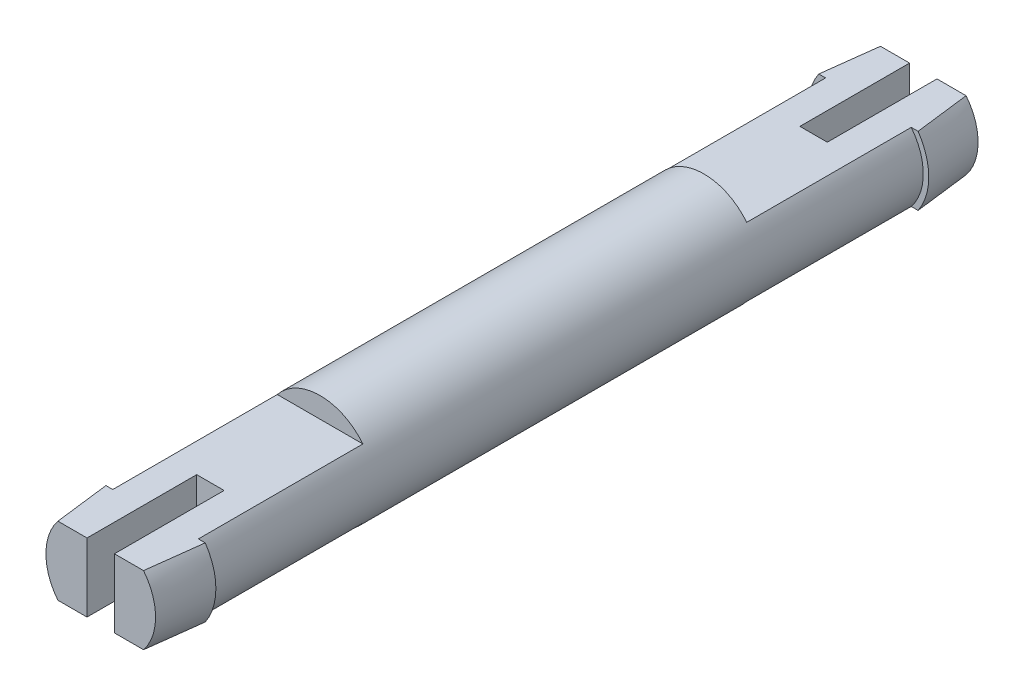
ISO-10303-21;
HEADER;
FILE_DESCRIPTION(('STEP AP214'),'2;1');
FILE_NAME('part.step','',(''),(''),'','','');
FILE_SCHEMA(('AUTOMOTIVE_DESIGN { 1 0 10303 214 1 1 1 1 }'));
ENDSEC;
DATA;
#1=APPLICATION_CONTEXT('core data for automotive mechanical design processes');
#2=APPLICATION_PROTOCOL_DEFINITION('international standard','automotive_design',2000,#1);
#3=PRODUCT_CONTEXT('',#1,'mechanical');
#4=PRODUCT('Part','Part','',(#3));
#5=PRODUCT_RELATED_PRODUCT_CATEGORY('part','',(#4));
#6=PRODUCT_DEFINITION_FORMATION('','',#4);
#7=PRODUCT_DEFINITION_CONTEXT('part definition',#1,'design');
#8=PRODUCT_DEFINITION('design','',#6,#7);
#9=PRODUCT_DEFINITION_SHAPE('','',#8);
#10=(LENGTH_UNIT() NAMED_UNIT(*) SI_UNIT(.MILLI.,.METRE.));
#11=(NAMED_UNIT(*) PLANE_ANGLE_UNIT() SI_UNIT($,.RADIAN.));
#12=(NAMED_UNIT(*) SI_UNIT($,.STERADIAN.) SOLID_ANGLE_UNIT());
#13=UNCERTAINTY_MEASURE_WITH_UNIT(LENGTH_MEASURE(1.E-05),#10,'distance_accuracy_value','');
#14=(GEOMETRIC_REPRESENTATION_CONTEXT(3) GLOBAL_UNCERTAINTY_ASSIGNED_CONTEXT((#13)) GLOBAL_UNIT_ASSIGNED_CONTEXT((#10,
#11,#12)) REPRESENTATION_CONTEXT('',''));
#15=CARTESIAN_POINT('',(0.,0.,0.));
#16=DIRECTION('',(0.,0.,1.));
#17=DIRECTION('',(1.,0.,0.));
#18=AXIS2_PLACEMENT_3D('',#15,#16,#17);
#19=CARTESIAN_POINT('',(0.,0.,-30.));
#20=DIRECTION('',(0.,0.,1.));
#21=DIRECTION('',(1.,0.,0.));
#22=AXIS2_PLACEMENT_3D('',#19,#20,#21);
#23=PLANE('',#22);
#24=DIRECTION('',(-1.,0.,0.));
#25=VECTOR('',#24,1.);
#26=CARTESIAN_POINT('',(0.,-1.25,-30.));
#27=LINE('',#26,#25);
#28=CARTESIAN_POINT('',(1.5612494995996,-1.25,-30.));
#29=VERTEX_POINT('',#28);
#30=CARTESIAN_POINT('',(0.500000000000001,-1.25,-30.));
#31=VERTEX_POINT('',#30);
#32=EDGE_CURVE('E218',#29,#31,#27,.T.);
#33=ORIENTED_EDGE('',*,*,#32,.T.);
#34=DIRECTION('',(0.,1.,0.));
#35=VECTOR('',#34,1.);
#36=CARTESIAN_POINT('',(0.500000000000001,-2.,-30.));
#37=LINE('',#36,#35);
#38=CARTESIAN_POINT('',(0.500000000000001,1.25,-30.));
#39=VERTEX_POINT('',#38);
#40=EDGE_CURVE('E204',#31,#39,#37,.T.);
#41=ORIENTED_EDGE('',*,*,#40,.T.);
#42=DIRECTION('',(1.,0.,0.));
#43=VECTOR('',#42,1.);
#44=CARTESIAN_POINT('',(0.,1.25,-30.));
#45=LINE('',#44,#43);
#46=CARTESIAN_POINT('',(1.5612494995996,1.25,-30.));
#47=VERTEX_POINT('',#46);
#48=EDGE_CURVE('E216',#39,#47,#45,.T.);
#49=ORIENTED_EDGE('',*,*,#48,.T.);
#50=CARTESIAN_POINT('',(0.,0.,-30.));
#51=DIRECTION('',(0.,0.,1.));
#52=DIRECTION('',(1.,0.,0.));
#53=AXIS2_PLACEMENT_3D('',#50,#51,#52);
#54=CIRCLE('',#53,2.);
#55=EDGE_CURVE('E421',#29,#47,#54,.T.);
#56=ORIENTED_EDGE('',*,*,#55,.F.);
#57=EDGE_LOOP('',(#33,#41,#49,#56));
#58=FACE_BOUND('',#57,.T.);
#59=ADVANCED_FACE('F39',(#58),#23,.F.);
#60=CARTESIAN_POINT('',(0.,0.,-28.));
#61=DIRECTION('',(0.,0.,1.));
#62=DIRECTION('',(1.,0.,0.));
#63=AXIS2_PLACEMENT_3D('',#60,#61,#62);
#64=PLANE('',#63);
#65=DIRECTION('',(-1.,0.,0.));
#66=VECTOR('',#65,1.);
#67=CARTESIAN_POINT('',(0.,-1.25,-28.));
#68=LINE('',#67,#66);
#69=CARTESIAN_POINT('',(1.81038669902327,-1.25,-28.0000000000001));
#70=VERTEX_POINT('',#69);
#71=CARTESIAN_POINT('',(1.5612494995996,-1.25,-28.));
#72=VERTEX_POINT('',#71);
#73=EDGE_CURVE('E266',#70,#72,#68,.T.);
#74=ORIENTED_EDGE('',*,*,#73,.F.);
#75=CARTESIAN_POINT('',(0.,0.,-28.));
#76=DIRECTION('',(0.,0.,1.));
#77=DIRECTION('',(1.,0.,0.));
#78=AXIS2_PLACEMENT_3D('',#75,#76,#77);
#79=CIRCLE('',#78,2.2);
#80=CARTESIAN_POINT('',(1.81038669902327,1.25,-28.0000000000001));
#81=VERTEX_POINT('',#80);
#82=EDGE_CURVE('E316',#70,#81,#79,.T.);
#83=ORIENTED_EDGE('',*,*,#82,.T.);
#84=DIRECTION('',(1.,0.,0.));
#85=VECTOR('',#84,1.);
#86=CARTESIAN_POINT('',(0.,1.25,-28.));
#87=LINE('',#86,#85);
#88=CARTESIAN_POINT('',(1.5612494995996,1.25,-28.));
#89=VERTEX_POINT('',#88);
#90=EDGE_CURVE('E299',#89,#81,#87,.T.);
#91=ORIENTED_EDGE('',*,*,#90,.F.);
#92=CARTESIAN_POINT('',(0.,0.,-28.));
#93=DIRECTION('',(0.,0.,1.));
#94=DIRECTION('',(1.,0.,0.));
#95=AXIS2_PLACEMENT_3D('',#92,#93,#94);
#96=CIRCLE('',#95,2.);
#97=EDGE_CURVE('E228',#89,#72,#96,.F.);
#98=ORIENTED_EDGE('',*,*,#97,.T.);
#99=EDGE_LOOP('',(#74,#83,#91,#98));
#100=FACE_BOUND('',#99,.T.);
#101=ADVANCED_FACE('F462',(#100),#64,.T.);
#102=CARTESIAN_POINT('',(0.,0.,-28.));
#103=DIRECTION('',(0.,0.,1.));
#104=DIRECTION('',(1.,0.,0.));
#105=AXIS2_PLACEMENT_3D('',#102,#103,#104);
#106=CONICAL_SURFACE('',#105,2.2,0.0996686524911631);
#107=CARTESIAN_POINT('',(-2.07154781563106,-1.25,-25.8053511030935));
#108=CARTESIAN_POINT('',(-2.03550722726415,-1.25,-26.1139180179247));
#109=CARTESIAN_POINT('',(-1.99922295149764,-1.25,-26.4224563190549));
#110=CARTESIAN_POINT('',(-1.92607039278533,-1.25,-27.0394648246496));
#111=CARTESIAN_POINT('',(-1.88920210764817,-1.25,-27.3479350288541));
#112=CARTESIAN_POINT('',(-1.77758091435319,-1.25,-28.2731887554346));
#113=CARTESIAN_POINT('',(-1.70180760472733,-1.25,-28.889850372761));
#114=CARTESIAN_POINT('',(-1.58512147260778,-1.25,-29.8144760218349));
#115=CARTESIAN_POINT('',(-1.54572075887383,-1.25,-30.122630781761));
#116=CARTESIAN_POINT('',(-1.46564062998623,-1.25,-30.73877265943));
#117=CARTESIAN_POINT('',(-1.42496122188891,-1.25,-31.0467597780885));
#118=CARTESIAN_POINT('',(-1.34198072748191,-1.25,-31.6625339402322));
#119=CARTESIAN_POINT('',(-1.29967955336674,-1.25,-31.9703209719642));
#120=CARTESIAN_POINT('',(-1.21285635248195,-1.25,-32.5855868834585));
#121=CARTESIAN_POINT('',(-1.16833428338408,-1.25,-32.8930657572336));
#122=CARTESIAN_POINT('',(-1.12240193199713,-1.25,-33.2003390005902));
#123=B_SPLINE_CURVE_WITH_KNOTS('',3,(#107,#108,#109,#110,#111,#112,#113,#114,#115,#116,#117,
#118,#119,#120,#121,#122),.UNSPECIFIED.,.F.,.F.,(4,2,2,2,2,2,2,4),(0.,0.931993165762317,
1.86398982945296,3.7278775087708,4.65986577266912,5.59184889439994,6.52388254692386,
7.45593396996271),.UNSPECIFIED.);
#124=CARTESIAN_POINT('',(-1.81038669902327,-1.25,-28.0000000000001));
#125=VERTEX_POINT('',#124);
#126=CARTESIAN_POINT('',(-1.5612494995996,-1.25,-30.));
#127=VERTEX_POINT('',#126);
#128=EDGE_CURVE('E281',#125,#127,#123,.T.);
#129=ORIENTED_EDGE('',*,*,#128,.F.);
#130=CARTESIAN_POINT('',(-1.81038669902327,1.25,-28.0000000000001));
#131=VERTEX_POINT('',#130);
#132=EDGE_CURVE('E317',#131,#125,#79,.T.);
#133=ORIENTED_EDGE('',*,*,#132,.F.);
#134=CARTESIAN_POINT('',(-1.12240193199713,1.25,-33.2003390005902));
#135=CARTESIAN_POINT('',(-1.16007318188191,1.25,-32.9484550212629));
#136=CARTESIAN_POINT('',(-1.19677568222067,1.25,-32.6964288561933));
#137=CARTESIAN_POINT('',(-1.26860770564257,1.25,-32.1921552657798));
#138=CARTESIAN_POINT('',(-1.30373724824443,1.25,-31.9399078432212));
#139=CARTESIAN_POINT('',(-1.37278762127904,1.25,-31.4352571718187));
#140=CARTESIAN_POINT('',(-1.40670849276504,1.25,-31.1828539285641));
#141=CARTESIAN_POINT('',(-1.47357063225506,1.25,-30.6779171395039));
#142=CARTESIAN_POINT('',(-1.50651189747342,1.25,-30.4253835933298));
#143=CARTESIAN_POINT('',(-1.56766910496901,1.25,-29.9506559350624));
#144=CARTESIAN_POINT('',(-1.59597605442951,1.25,-29.7284735200067));
#145=CARTESIAN_POINT('',(-1.66291250795864,1.25,-29.198043320873));
#146=CARTESIAN_POINT('',(-1.70129728585269,1.25,-28.8897646573885));
#147=CARTESIAN_POINT('',(-1.77723656698478,1.25,-28.2731045277542));
#148=CARTESIAN_POINT('',(-1.81479106820384,1.25,-27.9647230613564));
#149=CARTESIAN_POINT('',(-1.88921121609686,1.25,-27.3478817112025));
#150=CARTESIAN_POINT('',(-1.92607687286844,1.25,-27.0394218286632));
#151=CARTESIAN_POINT('',(-1.99922418459549,1.25,-26.4224342581659));
#152=CARTESIAN_POINT('',(-2.0355058422845,1.25,-26.1139065705321));
#153=CARTESIAN_POINT('',(-2.07154781563106,1.25,-25.8053511030935));
#154=B_SPLINE_CURVE_WITH_KNOTS('',3,(#134,#135,#136,#137,#138,#139,#140,#141,#142,#143,#144,
#145,#146,#147,#148,#149,#150,#151,#152,#153),.UNSPECIFIED.,.F.,.F.,(4,2,2,2,2,2,2,2,2,4),(0.,
0.764050536151589,1.52809158862138,2.29210666519175,3.05612391415667,3.72805834866275,
4.66003438385202,5.59201268506308,6.52397731386889,7.45593757911201),.UNSPECIFIED.);
#155=CARTESIAN_POINT('',(-1.5612494995996,1.25,-30.));
#156=VERTEX_POINT('',#155);
#157=EDGE_CURVE('E306',#156,#131,#154,.T.);
#158=ORIENTED_EDGE('',*,*,#157,.F.);
#159=EDGE_CURVE('E422',#156,#127,#54,.T.);
#160=ORIENTED_EDGE('',*,*,#159,.T.);
#161=EDGE_LOOP('',(#129,#133,#158,#160));
#162=FACE_BOUND('',#161,.T.);
#163=ADVANCED_FACE('F468',(#162),#106,.T.);
#164=CARTESIAN_POINT('',(0.,0.,0.));
#165=DIRECTION('',(0.,0.,1.));
#166=DIRECTION('',(1.,0.,0.));
#167=AXIS2_PLACEMENT_3D('',#164,#165,#166);
#168=PLANE('',#167);
#169=DIRECTION('',(0.,-1.,0.));
#170=VECTOR('',#169,1.);
#171=CARTESIAN_POINT('',(-0.5,2.001,0.));
#172=LINE('',#171,#170);
#173=CARTESIAN_POINT('',(-0.5,1.25,0.));
#174=VERTEX_POINT('',#173);
#175=CARTESIAN_POINT('',(-0.5,-1.25,0.));
#176=VERTEX_POINT('',#175);
#177=EDGE_CURVE('E333',#174,#176,#172,.T.);
#178=ORIENTED_EDGE('',*,*,#177,.F.);
#179=DIRECTION('',(1.,0.,0.));
#180=VECTOR('',#179,1.);
#181=CARTESIAN_POINT('',(0.,1.25,0.));
#182=LINE('',#181,#180);
#183=CARTESIAN_POINT('',(-1.5612494995996,1.25,0.));
#184=VERTEX_POINT('',#183);
#185=EDGE_CURVE('E436',#184,#174,#182,.T.);
#186=ORIENTED_EDGE('',*,*,#185,.F.);
#187=CARTESIAN_POINT('',(0.,0.,0.));
#188=DIRECTION('',(0.,0.,1.));
#189=DIRECTION('',(1.,0.,0.));
#190=AXIS2_PLACEMENT_3D('',#187,#188,#189);
#191=CIRCLE('',#190,2.);
#192=CARTESIAN_POINT('',(-1.5612494995996,-1.25,0.));
#193=VERTEX_POINT('',#192);
#194=EDGE_CURVE('E417',#184,#193,#191,.T.);
#195=ORIENTED_EDGE('',*,*,#194,.T.);
#196=DIRECTION('',(-1.,0.,0.));
#197=VECTOR('',#196,1.);
#198=CARTESIAN_POINT('',(0.,-1.25,0.));
#199=LINE('',#198,#197);
#200=EDGE_CURVE('E429',#176,#193,#199,.T.);
#201=ORIENTED_EDGE('',*,*,#200,.F.);
#202=EDGE_LOOP('',(#178,#186,#195,#201));
#203=FACE_BOUND('',#202,.T.);
#204=ADVANCED_FACE('F492',(#203),#168,.T.);
#205=CARTESIAN_POINT('',(0.,0.,0.));
#206=DIRECTION('',(0.,0.,-1.));
#207=DIRECTION('',(-1.,0.,0.));
#208=AXIS2_PLACEMENT_3D('',#205,#206,#207);
#209=CONICAL_SURFACE('',#208,2.,0.0996686524911612);
#210=CARTESIAN_POINT('',(-2.20629085167544,1.25,-5.35787712366069));
#211=CARTESIAN_POINT('',(-2.16911364127435,1.25,-5.03442418142203));
#212=CARTESIAN_POINT('',(-2.13171451989948,1.25,-4.71099685663596));
#213=CARTESIAN_POINT('',(-2.05638780976397,1.25,-4.06420290953939));
#214=CARTESIAN_POINT('',(-2.01846021960565,1.25,-3.74083628739171));
#215=CARTESIAN_POINT('',(-1.90376109024389,1.25,-2.77086975377676));
#216=CARTESIAN_POINT('',(-1.82607027221003,1.25,-2.12437765306016));
#217=CARTESIAN_POINT('',(-1.70685435031514,1.25,-1.15495865945316));
#218=CARTESIAN_POINT('',(-1.6666684414073,1.25,-0.831867113806437));
#219=CARTESIAN_POINT('',(-1.58517894557185,1.25,-0.185825927060357));
#220=CARTESIAN_POINT('',(-1.54387536251856,1.25,0.137123714526958));
#221=CARTESIAN_POINT('',(-1.45986916908057,1.25,0.782854266012029));
#222=CARTESIAN_POINT('',(-1.41716650618307,1.25,1.10563516911336));
#223=CARTESIAN_POINT('',(-1.32989270639121,1.25,1.75094775860943));
#224=CARTESIAN_POINT('',(-1.28532154707356,1.25,2.07347944196603));
#225=CARTESIAN_POINT('',(-1.23958118370651,1.25,2.39584846975234));
#226=B_SPLINE_CURVE_WITH_KNOTS('',3,(#210,#211,#212,#213,#214,#215,#216,#217,#218,#219,#220,
#221,#222,#223,#224,#225),.UNSPECIFIED.,.F.,.F.,(4,2,2,2,2,2,2,4),(0.,0.976747065340103,
1.95349671443936,3.90691894725974,4.88366075798535,5.86039918335277,6.83717431153944,
7.81396116508773),.UNSPECIFIED.);
#227=CARTESIAN_POINT('',(-1.81038669902317,1.25,-2.));
#228=VERTEX_POINT('',#227);
#229=EDGE_CURVE('E349',#228,#184,#226,.T.);
#230=ORIENTED_EDGE('',*,*,#229,.F.);
#231=CARTESIAN_POINT('',(0.,0.,-2.));
#232=DIRECTION('',(0.,0.,1.));
#233=DIRECTION('',(1.,0.,0.));
#234=AXIS2_PLACEMENT_3D('',#231,#232,#233);
#235=CIRCLE('',#234,2.2);
#236=CARTESIAN_POINT('',(-1.81038669902317,-1.25,-2.));
#237=VERTEX_POINT('',#236);
#238=EDGE_CURVE('E413',#228,#237,#235,.T.);
#239=ORIENTED_EDGE('',*,*,#238,.T.);
#240=CARTESIAN_POINT('',(-1.23958118370651,-1.25,2.39584846975234));
#241=CARTESIAN_POINT('',(-1.27708445163936,-1.25,2.1316265009786));
#242=CARTESIAN_POINT('',(-1.31378723609279,-1.25,1.86729257599781));
#243=CARTESIAN_POINT('',(-1.38587498011765,-1.25,1.33844690886303));
#244=CARTESIAN_POINT('',(-1.42125994975576,-1.25,1.07393516808307));
#245=CARTESIAN_POINT('',(-1.49099498681418,-1.25,0.544781873474838));
#246=CARTESIAN_POINT('',(-1.5253450774814,-1.25,0.280140322698454));
#247=CARTESIAN_POINT('',(-1.59319606726225,-1.25,-0.249251984131472));
#248=CARTESIAN_POINT('',(-1.62669696491898,-1.25,-0.514002740371576));
#249=CARTESIAN_POINT('',(-1.68902097967955,-1.25,-1.01186777884924));
#250=CARTESIAN_POINT('',(-1.71792365975446,-1.25,-1.24497212268678));
#251=CARTESIAN_POINT('',(-1.8260728146173,-1.25,-2.12439276505839));
#252=CARTESIAN_POINT('',(-1.90376491575885,-1.25,-2.77090043818358));
#253=CARTESIAN_POINT('',(-2.01846468029956,-1.25,-3.74087483946421));
#254=CARTESIAN_POINT('',(-2.056391393145,-1.25,-4.06423386196728));
#255=CARTESIAN_POINT('',(-2.13171635303436,-1.25,-4.71101241305846));
#256=CARTESIAN_POINT('',(-2.16911460179215,-1.25,-5.03443194144689));
#257=CARTESIAN_POINT('',(-2.20629085167544,-1.25,-5.35787712366069));
#258=B_SPLINE_CURVE_WITH_KNOTS('',3,(#240,#241,#242,#243,#244,#245,#246,#247,#248,#249,#250,
#251,#252,#253,#254,#255,#256,#257),.UNSPECIFIED.,.F.,.F.,(4,2,2,2,2,2,2,2,4),(0.,
0.800607232202053,1.60120834737589,2.40179146488677,3.2023759557953,3.90704351295182,
5.86051217913123,6.83723890380335,7.81396246011894),.UNSPECIFIED.);
#259=EDGE_CURVE('E404',#193,#237,#258,.T.);
#260=ORIENTED_EDGE('',*,*,#259,.F.);
#261=ORIENTED_EDGE('',*,*,#194,.F.);
#262=EDGE_LOOP('',(#230,#239,#260,#261));
#263=FACE_BOUND('',#262,.T.);
#264=ADVANCED_FACE('F496',(#263),#209,.T.);
#265=CARTESIAN_POINT('',(0.,0.,-2.));
#266=DIRECTION('',(0.,0.,-1.));
#267=DIRECTION('',(-1.,0.,0.));
#268=AXIS2_PLACEMENT_3D('',#265,#266,#267);
#269=PLANE('',#268);
#270=DIRECTION('',(-1.,0.,0.));
#271=VECTOR('',#270,1.);
#272=CARTESIAN_POINT('',(0.,1.25,-2.));
#273=LINE('',#272,#271);
#274=CARTESIAN_POINT('',(1.81038669902317,1.25,-2.));
#275=VERTEX_POINT('',#274);
#276=CARTESIAN_POINT('',(1.5612494995996,1.25,-2.));
#277=VERTEX_POINT('',#276);
#278=EDGE_CURVE('E350',#275,#277,#273,.T.);
#279=ORIENTED_EDGE('',*,*,#278,.F.);
#280=CARTESIAN_POINT('',(1.81038669902317,-1.25,-2.));
#281=VERTEX_POINT('',#280);
#282=EDGE_CURVE('E414',#281,#275,#235,.T.);
#283=ORIENTED_EDGE('',*,*,#282,.F.);
#284=DIRECTION('',(1.,0.,0.));
#285=VECTOR('',#284,1.);
#286=CARTESIAN_POINT('',(0.,-1.25,-2.));
#287=LINE('',#286,#285);
#288=CARTESIAN_POINT('',(1.5612494995996,-1.25,-2.));
#289=VERTEX_POINT('',#288);
#290=EDGE_CURVE('E386',#289,#281,#287,.T.);
#291=ORIENTED_EDGE('',*,*,#290,.F.);
#292=CARTESIAN_POINT('',(0.,0.,-2.));
#293=DIRECTION('',(0.,0.,-1.));
#294=DIRECTION('',(-1.,0.,0.));
#295=AXIS2_PLACEMENT_3D('',#292,#293,#294);
#296=CIRCLE('',#295,2.);
#297=EDGE_CURVE('E426',#289,#277,#296,.F.);
#298=ORIENTED_EDGE('',*,*,#297,.T.);
#299=EDGE_LOOP('',(#279,#283,#291,#298));
#300=FACE_BOUND('',#299,.T.);
#301=ADVANCED_FACE('F501',(#300),#269,.T.);
#302=CARTESIAN_POINT('',(0.,0.,-30.));
#303=DIRECTION('',(0.,0.,1.));
#304=DIRECTION('',(1.,0.,0.));
#305=AXIS2_PLACEMENT_3D('',#302,#303,#304);
#306=CYLINDRICAL_SURFACE('',#305,2.);
#307=DIRECTION('',(0.,0.,1.));
#308=VECTOR('',#307,1.);
#309=CARTESIAN_POINT('',(-1.5612494995996,-1.25,-30.));
#310=LINE('',#309,#308);
#311=CARTESIAN_POINT('',(-1.5612494995996,-1.25,-22.));
#312=VERTEX_POINT('',#311);
#313=CARTESIAN_POINT('',(-1.5612494995996,-1.25,-28.));
#314=VERTEX_POINT('',#313);
#315=EDGE_CURVE('E289',#312,#314,#310,.F.);
#316=ORIENTED_EDGE('',*,*,#315,.F.);
#317=CARTESIAN_POINT('',(0.,0.,-22.));
#318=DIRECTION('',(0.,0.,-1.));
#319=DIRECTION('',(-1.,0.,0.));
#320=AXIS2_PLACEMENT_3D('',#317,#318,#319);
#321=CIRCLE('',#320,2.);
#322=CARTESIAN_POINT('',(1.5612494995996,-1.25,-22.));
#323=VERTEX_POINT('',#322);
#324=EDGE_CURVE('E239',#312,#323,#321,.F.);
#325=ORIENTED_EDGE('',*,*,#324,.T.);
#326=DIRECTION('',(0.,0.,1.));
#327=VECTOR('',#326,1.);
#328=CARTESIAN_POINT('',(1.5612494995996,-1.25,-30.));
#329=LINE('',#328,#327);
#330=EDGE_CURVE('E288',#72,#323,#329,.T.);
#331=ORIENTED_EDGE('',*,*,#330,.F.);
#332=ORIENTED_EDGE('',*,*,#97,.F.);
#333=DIRECTION('',(0.,0.,1.));
#334=VECTOR('',#333,1.);
#335=CARTESIAN_POINT('',(1.5612494995996,1.25,-30.));
#336=LINE('',#335,#334);
#337=CARTESIAN_POINT('',(1.5612494995996,1.25,-22.));
#338=VERTEX_POINT('',#337);
#339=EDGE_CURVE('E313',#338,#89,#336,.F.);
#340=ORIENTED_EDGE('',*,*,#339,.F.);
#341=CARTESIAN_POINT('',(0.,0.,-22.));
#342=DIRECTION('',(0.,0.,1.));
#343=DIRECTION('',(1.,0.,0.));
#344=AXIS2_PLACEMENT_3D('',#341,#342,#343);
#345=CIRCLE('',#344,2.);
#346=CARTESIAN_POINT('',(-1.5612494995996,1.25,-22.));
#347=VERTEX_POINT('',#346);
#348=EDGE_CURVE('E231',#347,#338,#345,.F.);
#349=ORIENTED_EDGE('',*,*,#348,.F.);
#350=DIRECTION('',(0.,0.,1.));
#351=VECTOR('',#350,1.);
#352=CARTESIAN_POINT('',(-1.5612494995996,1.25,-30.));
#353=LINE('',#352,#351);
#354=CARTESIAN_POINT('',(-1.5612494995996,1.25,-28.));
#355=VERTEX_POINT('',#354);
#356=EDGE_CURVE('E314',#355,#347,#353,.T.);
#357=ORIENTED_EDGE('',*,*,#356,.F.);
#358=EDGE_CURVE('E233',#314,#355,#96,.F.);
#359=ORIENTED_EDGE('',*,*,#358,.F.);
#360=EDGE_LOOP('',(#316,#325,#331,#332,#340,#349,#357,#359));
#361=FACE_BOUND('',#360,.T.);
#362=DIRECTION('',(0.,0.,1.));
#363=VECTOR('',#362,1.);
#364=CARTESIAN_POINT('',(1.5612494995996,1.25,-30.));
#365=LINE('',#364,#363);
#366=CARTESIAN_POINT('',(1.5612494995996,1.25,-8.));
#367=VERTEX_POINT('',#366);
#368=EDGE_CURVE('E381',#277,#367,#365,.F.);
#369=ORIENTED_EDGE('',*,*,#368,.F.);
#370=ORIENTED_EDGE('',*,*,#297,.F.);
#371=DIRECTION('',(0.,0.,1.));
#372=VECTOR('',#371,1.);
#373=CARTESIAN_POINT('',(1.5612494995996,-1.25,-30.));
#374=LINE('',#373,#372);
#375=CARTESIAN_POINT('',(1.5612494995996,-1.25,-8.));
#376=VERTEX_POINT('',#375);
#377=EDGE_CURVE('E395',#376,#289,#374,.T.);
#378=ORIENTED_EDGE('',*,*,#377,.F.);
#379=CARTESIAN_POINT('',(0.,0.,-8.));
#380=DIRECTION('',(0.,0.,-1.));
#381=DIRECTION('',(-1.,0.,0.));
#382=AXIS2_PLACEMENT_3D('',#379,#380,#381);
#383=CIRCLE('',#382,2.);
#384=CARTESIAN_POINT('',(-1.5612494995996,-1.25,-8.));
#385=VERTEX_POINT('',#384);
#386=EDGE_CURVE('E433',#385,#376,#383,.F.);
#387=ORIENTED_EDGE('',*,*,#386,.F.);
#388=DIRECTION('',(0.,0.,1.));
#389=VECTOR('',#388,1.);
#390=CARTESIAN_POINT('',(-1.5612494995996,-1.25,-30.));
#391=LINE('',#390,#389);
#392=CARTESIAN_POINT('',(-1.5612494995996,-1.25,-2.));
#393=VERTEX_POINT('',#392);
#394=EDGE_CURVE('E411',#393,#385,#391,.F.);
#395=ORIENTED_EDGE('',*,*,#394,.F.);
#396=CARTESIAN_POINT('',(-1.5612494995996,1.25,-2.));
#397=VERTEX_POINT('',#396);
#398=EDGE_CURVE('E425',#397,#393,#296,.F.);
#399=ORIENTED_EDGE('',*,*,#398,.F.);
#400=DIRECTION('',(0.,0.,1.));
#401=VECTOR('',#400,1.);
#402=CARTESIAN_POINT('',(-1.5612494995996,1.25,-30.));
#403=LINE('',#402,#401);
#404=CARTESIAN_POINT('',(-1.5612494995996,1.25,-8.));
#405=VERTEX_POINT('',#404);
#406=EDGE_CURVE('E358',#405,#397,#403,.T.);
#407=ORIENTED_EDGE('',*,*,#406,.F.);
#408=CARTESIAN_POINT('',(0.,0.,-8.));
#409=DIRECTION('',(0.,0.,-1.));
#410=DIRECTION('',(-1.,0.,0.));
#411=AXIS2_PLACEMENT_3D('',#408,#409,#410);
#412=CIRCLE('',#411,2.);
#413=EDGE_CURVE('E438',#367,#405,#412,.F.);
#414=ORIENTED_EDGE('',*,*,#413,.F.);
#415=EDGE_LOOP('',(#369,#370,#378,#387,#395,#399,#407,#414));
#416=FACE_BOUND('',#415,.T.);
#417=ADVANCED_FACE('F41',(#361,#416),#306,.T.);
#418=CARTESIAN_POINT('',(1.23958118370651,1.25,2.39584846975234));
#419=CARTESIAN_POINT('',(1.27708445163936,1.25,2.1316265009786));
#420=CARTESIAN_POINT('',(1.31378723609279,1.25,1.86729257599781));
#421=CARTESIAN_POINT('',(1.38587498011765,1.25,1.33844690886303));
#422=CARTESIAN_POINT('',(1.42125994975576,1.25,1.07393516808307));
#423=CARTESIAN_POINT('',(1.49099498681418,1.25,0.544781873474838));
#424=CARTESIAN_POINT('',(1.5253450774814,1.25,0.280140322698454));
#425=CARTESIAN_POINT('',(1.59319606726225,1.25,-0.249251984131472));
#426=CARTESIAN_POINT('',(1.62669696491898,1.25,-0.514002740371576));
#427=CARTESIAN_POINT('',(1.68902097967955,1.25,-1.01186777884924));
#428=CARTESIAN_POINT('',(1.71792365975446,1.25,-1.24497212268678));
#429=CARTESIAN_POINT('',(1.8260728146173,1.25,-2.12439276505839));
#430=CARTESIAN_POINT('',(1.90376491575885,1.25,-2.77090043818358));
#431=CARTESIAN_POINT('',(2.01846468029956,1.25,-3.74087483946421));
#432=CARTESIAN_POINT('',(2.056391393145,1.25,-4.06423386196728));
#433=CARTESIAN_POINT('',(2.13171635303436,1.25,-4.71101241305846));
#434=CARTESIAN_POINT('',(2.16911460179215,1.25,-5.03443194144689));
#435=CARTESIAN_POINT('',(2.20629085167544,1.25,-5.35787712366069));
#436=B_SPLINE_CURVE_WITH_KNOTS('',3,(#418,#419,#420,#421,#422,#423,#424,#425,#426,#427,#428,
#429,#430,#431,#432,#433,#434,#435),.UNSPECIFIED.,.F.,.F.,(4,2,2,2,2,2,2,2,4),(0.,
0.800607232202053,1.60120834737589,2.40179146488677,3.2023759557953,3.90704351295182,
5.86051217913123,6.83723890380335,7.81396246011894),.UNSPECIFIED.);
#437=CARTESIAN_POINT('',(1.5612494995996,1.25,0.));
#438=VERTEX_POINT('',#437);
#439=EDGE_CURVE('E375',#438,#275,#436,.T.);
#440=ORIENTED_EDGE('',*,*,#439,.F.);
#441=CARTESIAN_POINT('',(1.5612494995996,-1.25,0.));
#442=VERTEX_POINT('',#441);
#443=EDGE_CURVE('E418',#442,#438,#191,.T.);
#444=ORIENTED_EDGE('',*,*,#443,.F.);
#445=CARTESIAN_POINT('',(2.20629085167544,-1.25,-5.35787712366069));
#446=CARTESIAN_POINT('',(2.16911364127435,-1.25,-5.03442418142203));
#447=CARTESIAN_POINT('',(2.13171451989948,-1.25,-4.71099685663596));
#448=CARTESIAN_POINT('',(2.05638780976397,-1.25,-4.06420290953939));
#449=CARTESIAN_POINT('',(2.01846021960565,-1.25,-3.74083628739171));
#450=CARTESIAN_POINT('',(1.90376109024389,-1.25,-2.77086975377676));
#451=CARTESIAN_POINT('',(1.82607027221003,-1.25,-2.12437765306016));
#452=CARTESIAN_POINT('',(1.70685435031514,-1.25,-1.15495865945316));
#453=CARTESIAN_POINT('',(1.6666684414073,-1.25,-0.831867113806437));
#454=CARTESIAN_POINT('',(1.58517894557185,-1.25,-0.185825927060357));
#455=CARTESIAN_POINT('',(1.54387536251856,-1.25,0.137123714526958));
#456=CARTESIAN_POINT('',(1.45986916908057,-1.25,0.782854266012029));
#457=CARTESIAN_POINT('',(1.41716650618307,-1.25,1.10563516911336));
#458=CARTESIAN_POINT('',(1.32989270639121,-1.25,1.75094775860943));
#459=CARTESIAN_POINT('',(1.28532154707356,-1.25,2.07347944196603));
#460=CARTESIAN_POINT('',(1.23958118370651,-1.25,2.39584846975234));
#461=B_SPLINE_CURVE_WITH_KNOTS('',3,(#445,#446,#447,#448,#449,#450,#451,#452,#453,#454,#455,
#456,#457,#458,#459,#460),.UNSPECIFIED.,.F.,.F.,(4,2,2,2,2,2,2,4),(0.,0.976747065340103,
1.95349671443936,3.90691894725974,4.88366075798535,5.86039918335277,6.83717431153944,
7.81396116508773),.UNSPECIFIED.);
#462=EDGE_CURVE('E388',#281,#442,#461,.T.);
#463=ORIENTED_EDGE('',*,*,#462,.F.);
#464=ORIENTED_EDGE('',*,*,#282,.T.);
#465=EDGE_LOOP('',(#440,#444,#463,#464));
#466=FACE_BOUND('',#465,.T.);
#467=ADVANCED_FACE('F360',(#466),#209,.T.);
#468=EDGE_CURVE('E347',#397,#228,#273,.T.);
#469=ORIENTED_EDGE('',*,*,#468,.F.);
#470=ORIENTED_EDGE('',*,*,#398,.T.);
#471=EDGE_CURVE('E389',#237,#393,#287,.T.);
#472=ORIENTED_EDGE('',*,*,#471,.F.);
#473=ORIENTED_EDGE('',*,*,#238,.F.);
#474=EDGE_LOOP('',(#469,#470,#472,#473));
#475=FACE_BOUND('',#474,.T.);
#476=ADVANCED_FACE('F402',(#475),#269,.T.);
#477=DIRECTION('',(0.,-1.,0.));
#478=VECTOR('',#477,1.);
#479=CARTESIAN_POINT('',(0.5,2.001,0.));
#480=LINE('',#479,#478);
#481=CARTESIAN_POINT('',(0.5,1.25,0.));
#482=VERTEX_POINT('',#481);
#483=CARTESIAN_POINT('',(0.5,-1.25,0.));
#484=VERTEX_POINT('',#483);
#485=EDGE_CURVE('E336',#482,#484,#480,.T.);
#486=ORIENTED_EDGE('',*,*,#485,.T.);
#487=EDGE_CURVE('E430',#442,#484,#199,.T.);
#488=ORIENTED_EDGE('',*,*,#487,.F.);
#489=ORIENTED_EDGE('',*,*,#443,.T.);
#490=EDGE_CURVE('E435',#482,#438,#182,.T.);
#491=ORIENTED_EDGE('',*,*,#490,.F.);
#492=EDGE_LOOP('',(#486,#488,#489,#491));
#493=FACE_BOUND('',#492,.T.);
#494=ADVANCED_FACE('F400',(#493),#168,.T.);
#495=CARTESIAN_POINT('',(-2.1,-1.25,-8.));
#496=DIRECTION('',(0.,1.,0.));
#497=DIRECTION('',(0.,0.,1.));
#498=AXIS2_PLACEMENT_3D('',#495,#496,#497);
#499=PLANE('',#498);
#500=DIRECTION('',(1.,0.,0.));
#501=VECTOR('',#500,1.);
#502=CARTESIAN_POINT('',(-0.5,-1.25,-4.));
#503=LINE('',#502,#501);
#504=CARTESIAN_POINT('',(-0.5,-1.25,-4.));
#505=VERTEX_POINT('',#504);
#506=CARTESIAN_POINT('',(0.5,-1.25,-4.));
#507=VERTEX_POINT('',#506);
#508=EDGE_CURVE('E327',#505,#507,#503,.T.);
#509=ORIENTED_EDGE('',*,*,#508,.F.);
#510=DIRECTION('',(0.,0.,-1.));
#511=VECTOR('',#510,1.);
#512=CARTESIAN_POINT('',(-0.5,-1.25,0.));
#513=LINE('',#512,#511);
#514=EDGE_CURVE('E324',#176,#505,#513,.T.);
#515=ORIENTED_EDGE('',*,*,#514,.F.);
#516=ORIENTED_EDGE('',*,*,#200,.T.);
#517=ORIENTED_EDGE('',*,*,#259,.T.);
#518=ORIENTED_EDGE('',*,*,#471,.T.);
#519=ORIENTED_EDGE('',*,*,#394,.T.);
#520=DIRECTION('',(-1.,0.,0.));
#521=VECTOR('',#520,1.);
#522=CARTESIAN_POINT('',(-2.1,-1.25,-8.));
#523=LINE('',#522,#521);
#524=EDGE_CURVE('E383',#376,#385,#523,.T.);
#525=ORIENTED_EDGE('',*,*,#524,.F.);
#526=ORIENTED_EDGE('',*,*,#377,.T.);
#527=ORIENTED_EDGE('',*,*,#290,.T.);
#528=ORIENTED_EDGE('',*,*,#462,.T.);
#529=ORIENTED_EDGE('',*,*,#487,.T.);
#530=DIRECTION('',(0.,0.,1.));
#531=VECTOR('',#530,1.);
#532=CARTESIAN_POINT('',(0.5,-1.25,0.));
#533=LINE('',#532,#531);
#534=EDGE_CURVE('E330',#507,#484,#533,.T.);
#535=ORIENTED_EDGE('',*,*,#534,.F.);
#536=EDGE_LOOP('',(#509,#515,#516,#517,#518,#519,#525,#526,#527,#528,#529,#535));
#537=FACE_BOUND('',#536,.T.);
#538=ADVANCED_FACE('F397',(#537),#499,.F.);
#539=CARTESIAN_POINT('',(-2.1,-1.25,-8.));
#540=DIRECTION('',(0.,0.,-1.));
#541=DIRECTION('',(-1.,0.,0.));
#542=AXIS2_PLACEMENT_3D('',#539,#540,#541);
#543=PLANE('',#542);
#544=ORIENTED_EDGE('',*,*,#386,.T.);
#545=ORIENTED_EDGE('',*,*,#524,.T.);
#546=EDGE_LOOP('',(#544,#545));
#547=FACE_BOUND('',#546,.T.);
#548=ADVANCED_FACE('F370',(#547),#543,.F.);
#549=CARTESIAN_POINT('',(-2.1,1.25,-8.));
#550=DIRECTION('',(0.,-1.,0.));
#551=DIRECTION('',(0.,0.,-1.));
#552=AXIS2_PLACEMENT_3D('',#549,#550,#551);
#553=PLANE('',#552);
#554=ORIENTED_EDGE('',*,*,#185,.T.);
#555=DIRECTION('',(0.,0.,1.));
#556=VECTOR('',#555,1.);
#557=CARTESIAN_POINT('',(-0.5,1.25,0.));
#558=LINE('',#557,#556);
#559=CARTESIAN_POINT('',(-0.5,1.25,-4.));
#560=VERTEX_POINT('',#559);
#561=EDGE_CURVE('E322',#560,#174,#558,.T.);
#562=ORIENTED_EDGE('',*,*,#561,.F.);
#563=DIRECTION('',(-1.,0.,0.));
#564=VECTOR('',#563,1.);
#565=CARTESIAN_POINT('',(-0.5,1.25,-4.));
#566=LINE('',#565,#564);
#567=CARTESIAN_POINT('',(0.5,1.25,-4.));
#568=VERTEX_POINT('',#567);
#569=EDGE_CURVE('E335',#568,#560,#566,.T.);
#570=ORIENTED_EDGE('',*,*,#569,.F.);
#571=DIRECTION('',(0.,0.,-1.));
#572=VECTOR('',#571,1.);
#573=CARTESIAN_POINT('',(0.5,1.25,0.));
#574=LINE('',#573,#572);
#575=EDGE_CURVE('E320',#482,#568,#574,.T.);
#576=ORIENTED_EDGE('',*,*,#575,.F.);
#577=ORIENTED_EDGE('',*,*,#490,.T.);
#578=ORIENTED_EDGE('',*,*,#439,.T.);
#579=ORIENTED_EDGE('',*,*,#278,.T.);
#580=ORIENTED_EDGE('',*,*,#368,.T.);
#581=DIRECTION('',(1.,0.,0.));
#582=VECTOR('',#581,1.);
#583=CARTESIAN_POINT('',(-2.1,1.25,-8.));
#584=LINE('',#583,#582);
#585=EDGE_CURVE('E344',#405,#367,#584,.T.);
#586=ORIENTED_EDGE('',*,*,#585,.F.);
#587=ORIENTED_EDGE('',*,*,#406,.T.);
#588=ORIENTED_EDGE('',*,*,#468,.T.);
#589=ORIENTED_EDGE('',*,*,#229,.T.);
#590=EDGE_LOOP('',(#554,#562,#570,#576,#577,#578,#579,#580,#586,#587,#588,#589));
#591=FACE_BOUND('',#590,.T.);
#592=ADVANCED_FACE('F364',(#591),#553,.F.);
#593=CARTESIAN_POINT('',(2.1,2.25,-8.));
#594=DIRECTION('',(0.,0.,-1.));
#595=DIRECTION('',(-1.,0.,0.));
#596=AXIS2_PLACEMENT_3D('',#593,#594,#595);
#597=PLANE('',#596);
#598=ORIENTED_EDGE('',*,*,#413,.T.);
#599=ORIENTED_EDGE('',*,*,#585,.T.);
#600=EDGE_LOOP('',(#598,#599));
#601=FACE_BOUND('',#600,.T.);
#602=ADVANCED_FACE('F369',(#601),#597,.F.);
#603=CARTESIAN_POINT('',(-0.5,2.001,0.));
#604=DIRECTION('',(-1.,0.,0.));
#605=DIRECTION('',(0.,0.,1.));
#606=AXIS2_PLACEMENT_3D('',#603,#604,#605);
#607=PLANE('',#606);
#608=ORIENTED_EDGE('',*,*,#561,.T.);
#609=ORIENTED_EDGE('',*,*,#177,.T.);
#610=ORIENTED_EDGE('',*,*,#514,.T.);
#611=DIRECTION('',(0.,-1.,0.));
#612=VECTOR('',#611,1.);
#613=CARTESIAN_POINT('',(-0.5,2.001,-4.));
#614=LINE('',#613,#612);
#615=EDGE_CURVE('E332',#560,#505,#614,.T.);
#616=ORIENTED_EDGE('',*,*,#615,.F.);
#617=EDGE_LOOP('',(#608,#609,#610,#616));
#618=FACE_BOUND('',#617,.T.);
#619=ADVANCED_FACE('F555',(#618),#607,.F.);
#620=CARTESIAN_POINT('',(0.5,2.001,0.));
#621=DIRECTION('',(1.,0.,0.));
#622=DIRECTION('',(0.,0.,-1.));
#623=AXIS2_PLACEMENT_3D('',#620,#621,#622);
#624=PLANE('',#623);
#625=ORIENTED_EDGE('',*,*,#575,.T.);
#626=DIRECTION('',(0.,-1.,0.));
#627=VECTOR('',#626,1.);
#628=CARTESIAN_POINT('',(0.5,2.001,-4.));
#629=LINE('',#628,#627);
#630=EDGE_CURVE('E339',#568,#507,#629,.T.);
#631=ORIENTED_EDGE('',*,*,#630,.T.);
#632=ORIENTED_EDGE('',*,*,#534,.T.);
#633=ORIENTED_EDGE('',*,*,#485,.F.);
#634=EDGE_LOOP('',(#625,#631,#632,#633));
#635=FACE_BOUND('',#634,.T.);
#636=ADVANCED_FACE('F560',(#635),#624,.F.);
#637=CARTESIAN_POINT('',(-0.5,2.001,-4.));
#638=DIRECTION('',(0.,0.,-1.));
#639=DIRECTION('',(-1.,0.,0.));
#640=AXIS2_PLACEMENT_3D('',#637,#638,#639);
#641=PLANE('',#640);
#642=ORIENTED_EDGE('',*,*,#569,.T.);
#643=ORIENTED_EDGE('',*,*,#615,.T.);
#644=ORIENTED_EDGE('',*,*,#508,.T.);
#645=ORIENTED_EDGE('',*,*,#630,.F.);
#646=EDGE_LOOP('',(#642,#643,#644,#645));
#647=FACE_BOUND('',#646,.T.);
#648=ADVANCED_FACE('F489',(#647),#641,.F.);
#649=EDGE_CURVE('E287',#314,#125,#68,.T.);
#650=ORIENTED_EDGE('',*,*,#649,.F.);
#651=ORIENTED_EDGE('',*,*,#358,.T.);
#652=EDGE_CURVE('E312',#131,#355,#87,.T.);
#653=ORIENTED_EDGE('',*,*,#652,.F.);
#654=ORIENTED_EDGE('',*,*,#132,.T.);
#655=EDGE_LOOP('',(#650,#651,#653,#654));
#656=FACE_BOUND('',#655,.T.);
#657=ADVANCED_FACE('F447',(#656),#64,.T.);
#658=CARTESIAN_POINT('',(1.12240193199713,-1.25,-33.2003390005902));
#659=CARTESIAN_POINT('',(1.16007318188191,-1.25,-32.9484550212629));
#660=CARTESIAN_POINT('',(1.19677568222068,-1.25,-32.6964288561933));
#661=CARTESIAN_POINT('',(1.26860770564257,-1.25,-32.1921552657798));
#662=CARTESIAN_POINT('',(1.30373724824443,-1.25,-31.9399078432212));
#663=CARTESIAN_POINT('',(1.37278762127905,-1.25,-31.4352571718187));
#664=CARTESIAN_POINT('',(1.40670849276504,-1.25,-31.1828539285641));
#665=CARTESIAN_POINT('',(1.47357063225507,-1.25,-30.6779171395039));
#666=CARTESIAN_POINT('',(1.50651189747342,-1.25,-30.4253835933298));
#667=CARTESIAN_POINT('',(1.56766910496902,-1.25,-29.9506559350624));
#668=CARTESIAN_POINT('',(1.59597605442952,-1.25,-29.7284735200067));
#669=CARTESIAN_POINT('',(1.66291250795864,-1.25,-29.198043320873));
#670=CARTESIAN_POINT('',(1.70129728585269,-1.25,-28.8897646573885));
#671=CARTESIAN_POINT('',(1.77723656698478,-1.25,-28.2731045277542));
#672=CARTESIAN_POINT('',(1.81479106820385,-1.25,-27.9647230613564));
#673=CARTESIAN_POINT('',(1.88921121609687,-1.25,-27.3478817112025));
#674=CARTESIAN_POINT('',(1.92607687286845,-1.25,-27.0394218286632));
#675=CARTESIAN_POINT('',(1.99922418459549,-1.25,-26.4224342581659));
#676=CARTESIAN_POINT('',(2.03550584228451,-1.25,-26.1139065705321));
#677=CARTESIAN_POINT('',(2.07154781563106,-1.25,-25.8053511030935));
#678=B_SPLINE_CURVE_WITH_KNOTS('',3,(#658,#659,#660,#661,#662,#663,#664,#665,#666,#667,#668,
#669,#670,#671,#672,#673,#674,#675,#676,#677),.UNSPECIFIED.,.F.,.F.,(4,2,2,2,2,2,2,2,2,4),(0.,
0.764050536151589,1.52809158862138,2.29210666519175,3.05612391415667,3.72805834866275,
4.66003438385202,5.59201268506308,6.52397731386889,7.45593757911201),.UNSPECIFIED.);
#679=EDGE_CURVE('E252',#29,#70,#678,.T.);
#680=ORIENTED_EDGE('',*,*,#679,.F.);
#681=ORIENTED_EDGE('',*,*,#55,.T.);
#682=CARTESIAN_POINT('',(2.07154781563106,1.25,-25.8053511030935));
#683=CARTESIAN_POINT('',(2.03550722726415,1.25,-26.1139180179247));
#684=CARTESIAN_POINT('',(1.99922295149765,1.25,-26.4224563190549));
#685=CARTESIAN_POINT('',(1.92607039278534,1.25,-27.0394648246496));
#686=CARTESIAN_POINT('',(1.88920210764817,1.25,-27.3479350288541));
#687=CARTESIAN_POINT('',(1.7775809143532,1.25,-28.2731887554346));
#688=CARTESIAN_POINT('',(1.70180760472734,1.25,-28.889850372761));
#689=CARTESIAN_POINT('',(1.58512147260778,1.25,-29.8144760218349));
#690=CARTESIAN_POINT('',(1.54572075887383,1.25,-30.122630781761));
#691=CARTESIAN_POINT('',(1.46564062998624,1.25,-30.73877265943));
#692=CARTESIAN_POINT('',(1.42496122188892,1.25,-31.0467597780885));
#693=CARTESIAN_POINT('',(1.34198072748192,1.25,-31.6625339402322));
#694=CARTESIAN_POINT('',(1.29967955336674,1.25,-31.9703209719642));
#695=CARTESIAN_POINT('',(1.21285635248195,1.25,-32.5855868834585));
#696=CARTESIAN_POINT('',(1.16833428338408,1.25,-32.8930657572336));
#697=CARTESIAN_POINT('',(1.12240193199713,1.25,-33.2003390005902));
#698=B_SPLINE_CURVE_WITH_KNOTS('',3,(#682,#683,#684,#685,#686,#687,#688,#689,#690,#691,#692,
#693,#694,#695,#696,#697),.UNSPECIFIED.,.F.,.F.,(4,2,2,2,2,2,2,4),(0.,0.931993165762317,
1.86398982945296,3.7278775087708,4.65986577266912,5.59184889439994,6.52388254692386,
7.45593396996271),.UNSPECIFIED.);
#699=EDGE_CURVE('E226',#81,#47,#698,.T.);
#700=ORIENTED_EDGE('',*,*,#699,.F.);
#701=ORIENTED_EDGE('',*,*,#82,.F.);
#702=EDGE_LOOP('',(#680,#681,#700,#701));
#703=FACE_BOUND('',#702,.T.);
#704=ADVANCED_FACE('F268',(#703),#106,.T.);
#705=CARTESIAN_POINT('',(-0.500000000000001,1.25,-30.));
#706=VERTEX_POINT('',#705);
#707=EDGE_CURVE('E227',#156,#706,#45,.T.);
#708=ORIENTED_EDGE('',*,*,#707,.T.);
#709=DIRECTION('',(0.,1.,0.));
#710=VECTOR('',#709,1.);
#711=CARTESIAN_POINT('',(-0.500000000000001,-2.,-30.));
#712=LINE('',#711,#710);
#713=CARTESIAN_POINT('',(-0.500000000000001,-1.25,-30.));
#714=VERTEX_POINT('',#713);
#715=EDGE_CURVE('E219',#714,#706,#712,.T.);
#716=ORIENTED_EDGE('',*,*,#715,.F.);
#717=EDGE_CURVE('E62',#714,#127,#27,.T.);
#718=ORIENTED_EDGE('',*,*,#717,.T.);
#719=ORIENTED_EDGE('',*,*,#159,.F.);
#720=EDGE_LOOP('',(#708,#716,#718,#719));
#721=FACE_BOUND('',#720,.T.);
#722=ADVANCED_FACE('F303',(#721),#23,.F.);
#723=CARTESIAN_POINT('',(2.1,1.25,-22.));
#724=DIRECTION('',(0.,-1.,0.));
#725=DIRECTION('',(0.,0.,-1.));
#726=AXIS2_PLACEMENT_3D('',#723,#724,#725);
#727=PLANE('',#726);
#728=ORIENTED_EDGE('',*,*,#48,.F.);
#729=DIRECTION('',(0.,0.,-1.));
#730=VECTOR('',#729,1.);
#731=CARTESIAN_POINT('',(0.500000000000001,1.25,-26.));
#732=LINE('',#731,#730);
#733=CARTESIAN_POINT('',(0.500000000000001,1.25,-26.));
#734=VERTEX_POINT('',#733);
#735=EDGE_CURVE('E201',#734,#39,#732,.T.);
#736=ORIENTED_EDGE('',*,*,#735,.F.);
#737=DIRECTION('',(1.,0.,0.));
#738=VECTOR('',#737,1.);
#739=CARTESIAN_POINT('',(-0.499999999999999,1.25,-26.));
#740=LINE('',#739,#738);
#741=CARTESIAN_POINT('',(-0.499999999999999,1.25,-26.));
#742=VERTEX_POINT('',#741);
#743=EDGE_CURVE('E220',#742,#734,#740,.T.);
#744=ORIENTED_EDGE('',*,*,#743,.F.);
#745=DIRECTION('',(0.,0.,1.));
#746=VECTOR('',#745,1.);
#747=CARTESIAN_POINT('',(-0.499999999999999,1.25,-26.));
#748=LINE('',#747,#746);
#749=EDGE_CURVE('E211',#706,#742,#748,.T.);
#750=ORIENTED_EDGE('',*,*,#749,.F.);
#751=ORIENTED_EDGE('',*,*,#707,.F.);
#752=ORIENTED_EDGE('',*,*,#157,.T.);
#753=ORIENTED_EDGE('',*,*,#652,.T.);
#754=ORIENTED_EDGE('',*,*,#356,.T.);
#755=DIRECTION('',(-1.,0.,0.));
#756=VECTOR('',#755,1.);
#757=CARTESIAN_POINT('',(2.1,1.25,-22.));
#758=LINE('',#757,#756);
#759=EDGE_CURVE('E291',#338,#347,#758,.T.);
#760=ORIENTED_EDGE('',*,*,#759,.F.);
#761=ORIENTED_EDGE('',*,*,#339,.T.);
#762=ORIENTED_EDGE('',*,*,#90,.T.);
#763=ORIENTED_EDGE('',*,*,#699,.T.);
#764=EDGE_LOOP('',(#728,#736,#744,#750,#751,#752,#753,#754,#760,#761,#762,#763));
#765=FACE_BOUND('',#764,.T.);
#766=ADVANCED_FACE('F223',(#765),#727,.F.);
#767=CARTESIAN_POINT('',(2.1,2.25,-22.));
#768=DIRECTION('',(0.,0.,1.));
#769=DIRECTION('',(1.,0.,0.));
#770=AXIS2_PLACEMENT_3D('',#767,#768,#769);
#771=PLANE('',#770);
#772=ORIENTED_EDGE('',*,*,#348,.T.);
#773=ORIENTED_EDGE('',*,*,#759,.T.);
#774=EDGE_LOOP('',(#772,#773));
#775=FACE_BOUND('',#774,.T.);
#776=ADVANCED_FACE('F277',(#775),#771,.F.);
#777=CARTESIAN_POINT('',(2.1,-1.25,-22.));
#778=DIRECTION('',(0.,1.,0.));
#779=DIRECTION('',(0.,0.,1.));
#780=AXIS2_PLACEMENT_3D('',#777,#778,#779);
#781=PLANE('',#780);
#782=DIRECTION('',(1.,0.,0.));
#783=VECTOR('',#782,1.);
#784=CARTESIAN_POINT('',(2.1,-1.25,-26.));
#785=LINE('',#784,#783);
#786=CARTESIAN_POINT('',(-0.5,-1.25,-26.));
#787=VERTEX_POINT('',#786);
#788=CARTESIAN_POINT('',(0.500000000000001,-1.25,-26.));
#789=VERTEX_POINT('',#788);
#790=EDGE_CURVE('E47',#787,#789,#785,.T.);
#791=ORIENTED_EDGE('',*,*,#790,.T.);
#792=DIRECTION('',(0.,0.,-1.));
#793=VECTOR('',#792,1.);
#794=CARTESIAN_POINT('',(0.5,-1.25,-22.));
#795=LINE('',#794,#793);
#796=EDGE_CURVE('E11',#789,#31,#795,.T.);
#797=ORIENTED_EDGE('',*,*,#796,.T.);
#798=ORIENTED_EDGE('',*,*,#32,.F.);
#799=ORIENTED_EDGE('',*,*,#679,.T.);
#800=ORIENTED_EDGE('',*,*,#73,.T.);
#801=ORIENTED_EDGE('',*,*,#330,.T.);
#802=DIRECTION('',(1.,0.,0.));
#803=VECTOR('',#802,1.);
#804=CARTESIAN_POINT('',(2.1,-1.25,-22.));
#805=LINE('',#804,#803);
#806=EDGE_CURVE('E249',#312,#323,#805,.T.);
#807=ORIENTED_EDGE('',*,*,#806,.F.);
#808=ORIENTED_EDGE('',*,*,#315,.T.);
#809=ORIENTED_EDGE('',*,*,#649,.T.);
#810=ORIENTED_EDGE('',*,*,#128,.T.);
#811=ORIENTED_EDGE('',*,*,#717,.F.);
#812=DIRECTION('',(0.,0.,1.));
#813=VECTOR('',#812,1.);
#814=CARTESIAN_POINT('',(-0.499999999999999,-1.25,-22.));
#815=LINE('',#814,#813);
#816=EDGE_CURVE('E242',#714,#787,#815,.T.);
#817=ORIENTED_EDGE('',*,*,#816,.T.);
#818=EDGE_LOOP('',(#791,#797,#798,#799,#800,#801,#807,#808,#809,#810,#811,#817));
#819=FACE_BOUND('',#818,.T.);
#820=ADVANCED_FACE('F246',(#819),#781,.F.);
#821=CARTESIAN_POINT('',(2.1,-2.25,-22.));
#822=DIRECTION('',(0.,0.,-1.));
#823=DIRECTION('',(-1.,0.,0.));
#824=AXIS2_PLACEMENT_3D('',#821,#822,#823);
#825=PLANE('',#824);
#826=ORIENTED_EDGE('',*,*,#806,.T.);
#827=ORIENTED_EDGE('',*,*,#324,.F.);
#828=EDGE_LOOP('',(#826,#827));
#829=FACE_BOUND('',#828,.T.);
#830=ADVANCED_FACE('F276',(#829),#825,.T.);
#831=CARTESIAN_POINT('',(0.500000000000001,-2.,-26.));
#832=DIRECTION('',(1.,0.,0.));
#833=DIRECTION('',(0.,0.,-1.));
#834=AXIS2_PLACEMENT_3D('',#831,#832,#833);
#835=PLANE('',#834);
#836=DIRECTION('',(0.,1.,0.));
#837=VECTOR('',#836,1.);
#838=CARTESIAN_POINT('',(0.500000000000001,-2.,-26.));
#839=LINE('',#838,#837);
#840=EDGE_CURVE('E206',#789,#734,#839,.T.);
#841=ORIENTED_EDGE('',*,*,#840,.T.);
#842=ORIENTED_EDGE('',*,*,#735,.T.);
#843=ORIENTED_EDGE('',*,*,#40,.F.);
#844=ORIENTED_EDGE('',*,*,#796,.F.);
#845=EDGE_LOOP('',(#841,#842,#843,#844));
#846=FACE_BOUND('',#845,.T.);
#847=ADVANCED_FACE('F203',(#846),#835,.F.);
#848=CARTESIAN_POINT('',(-0.499999999999999,-2.,-26.));
#849=DIRECTION('',(0.,0.,1.));
#850=DIRECTION('',(1.,0.,0.));
#851=AXIS2_PLACEMENT_3D('',#848,#849,#850);
#852=PLANE('',#851);
#853=DIRECTION('',(0.,1.,0.));
#854=VECTOR('',#853,1.);
#855=CARTESIAN_POINT('',(-0.499999999999999,-2.,-26.));
#856=LINE('',#855,#854);
#857=EDGE_CURVE('E54',#787,#742,#856,.T.);
#858=ORIENTED_EDGE('',*,*,#857,.T.);
#859=ORIENTED_EDGE('',*,*,#743,.T.);
#860=ORIENTED_EDGE('',*,*,#840,.F.);
#861=ORIENTED_EDGE('',*,*,#790,.F.);
#862=EDGE_LOOP('',(#858,#859,#860,#861));
#863=FACE_BOUND('',#862,.T.);
#864=ADVANCED_FACE('F248',(#863),#852,.F.);
#865=CARTESIAN_POINT('',(-0.499999999999999,-2.,-26.));
#866=DIRECTION('',(-1.,0.,0.));
#867=DIRECTION('',(0.,0.,1.));
#868=AXIS2_PLACEMENT_3D('',#865,#866,#867);
#869=PLANE('',#868);
#870=ORIENTED_EDGE('',*,*,#715,.T.);
#871=ORIENTED_EDGE('',*,*,#749,.T.);
#872=ORIENTED_EDGE('',*,*,#857,.F.);
#873=ORIENTED_EDGE('',*,*,#816,.F.);
#874=EDGE_LOOP('',(#870,#871,#872,#873));
#875=FACE_BOUND('',#874,.T.);
#876=ADVANCED_FACE('F470',(#875),#869,.F.);
#877=CLOSED_SHELL('',(#59,#101,#163,#204,#264,#301,#417,#467,#476,#494,#538,#548,#592,#602,#619,
#636,#648,#657,#704,#722,#766,#776,#820,#830,#847,#864,#876));
#878=MANIFOLD_SOLID_BREP('B2',#877);
#879=ADVANCED_BREP_SHAPE_REPRESENTATION('',(#18,#878),#14);
#880=SHAPE_DEFINITION_REPRESENTATION(#9,#879);
ENDSEC;
END-ISO-10303-21;
